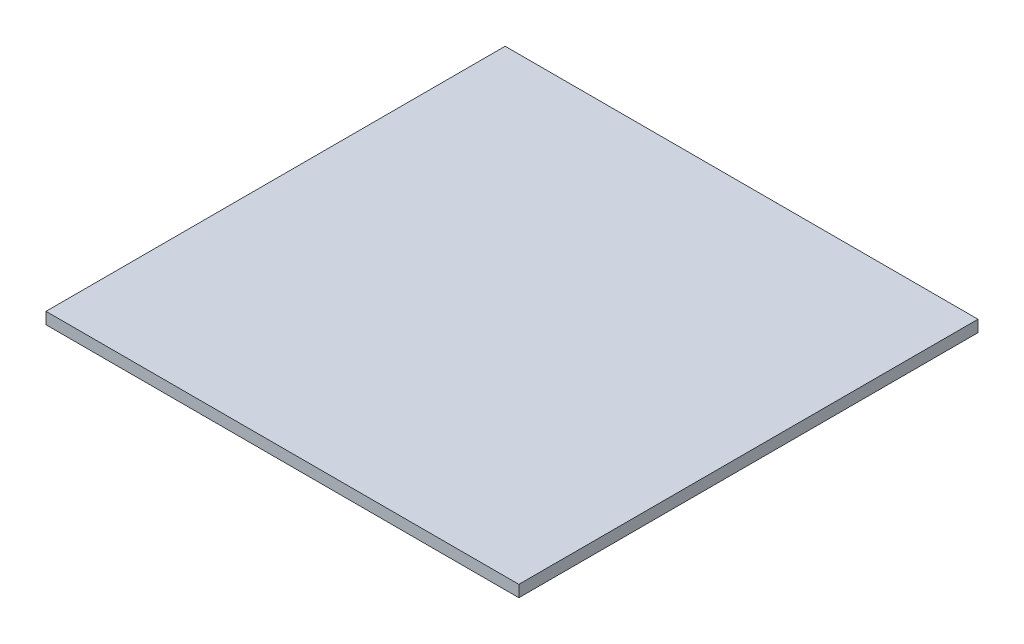
ISO-10303-21;
HEADER;
FILE_DESCRIPTION(('STEP AP214'),'2;1');
FILE_NAME('part.step','',(''),(''),'','','');
FILE_SCHEMA(('AUTOMOTIVE_DESIGN { 1 0 10303 214 1 1 1 1 }'));
ENDSEC;
DATA;
#1=APPLICATION_CONTEXT('core data for automotive mechanical design processes');
#2=APPLICATION_PROTOCOL_DEFINITION('international standard','automotive_design',2000,#1);
#3=PRODUCT_CONTEXT('',#1,'mechanical');
#4=PRODUCT('Part','Part','',(#3));
#5=PRODUCT_RELATED_PRODUCT_CATEGORY('part','',(#4));
#6=PRODUCT_DEFINITION_FORMATION('','',#4);
#7=PRODUCT_DEFINITION_CONTEXT('part definition',#1,'design');
#8=PRODUCT_DEFINITION('design','',#6,#7);
#9=PRODUCT_DEFINITION_SHAPE('','',#8);
#10=(LENGTH_UNIT() NAMED_UNIT(*) SI_UNIT(.MILLI.,.METRE.));
#11=(NAMED_UNIT(*) PLANE_ANGLE_UNIT() SI_UNIT($,.RADIAN.));
#12=(NAMED_UNIT(*) SI_UNIT($,.STERADIAN.) SOLID_ANGLE_UNIT());
#13=UNCERTAINTY_MEASURE_WITH_UNIT(LENGTH_MEASURE(1.E-05),#10,'distance_accuracy_value','');
#14=(GEOMETRIC_REPRESENTATION_CONTEXT(3) GLOBAL_UNCERTAINTY_ASSIGNED_CONTEXT((#13)) GLOBAL_UNIT_ASSIGNED_CONTEXT((#10,
#11,#12)) REPRESENTATION_CONTEXT('',''));
#15=CARTESIAN_POINT('',(0.,0.,0.));
#16=DIRECTION('',(0.,0.,1.));
#17=DIRECTION('',(1.,0.,0.));
#18=AXIS2_PLACEMENT_3D('',#15,#16,#17);
#19=CARTESIAN_POINT('',(0.,1.7,0.));
#20=DIRECTION('',(1.,0.,0.));
#21=DIRECTION('',(0.,0.,-1.));
#22=AXIS2_PLACEMENT_3D('',#19,#20,#21);
#23=PLANE('',#22);
#24=DIRECTION('',(0.,0.,1.));
#25=VECTOR('',#24,1.);
#26=CARTESIAN_POINT('',(0.,0.,0.));
#27=LINE('',#26,#25);
#28=CARTESIAN_POINT('',(0.,0.,-67.));
#29=VERTEX_POINT('',#28);
#30=CARTESIAN_POINT('',(0.,0.,0.));
#31=VERTEX_POINT('',#30);
#32=EDGE_CURVE('E95',#29,#31,#27,.T.);
#33=ORIENTED_EDGE('',*,*,#32,.T.);
#34=DIRECTION('',(0.,-1.,0.));
#35=VECTOR('',#34,1.);
#36=CARTESIAN_POINT('',(0.,1.7,0.));
#37=LINE('',#36,#35);
#38=CARTESIAN_POINT('',(0.,1.7,0.));
#39=VERTEX_POINT('',#38);
#40=EDGE_CURVE('E11',#39,#31,#37,.T.);
#41=ORIENTED_EDGE('',*,*,#40,.F.);
#42=DIRECTION('',(0.,0.,1.));
#43=VECTOR('',#42,1.);
#44=CARTESIAN_POINT('',(0.,1.7,0.));
#45=LINE('',#44,#43);
#46=CARTESIAN_POINT('',(0.,1.7,-67.));
#47=VERTEX_POINT('',#46);
#48=EDGE_CURVE('E83',#47,#39,#45,.T.);
#49=ORIENTED_EDGE('',*,*,#48,.F.);
#50=DIRECTION('',(0.,-1.,0.));
#51=VECTOR('',#50,1.);
#52=CARTESIAN_POINT('',(0.,1.7,-67.));
#53=LINE('',#52,#51);
#54=EDGE_CURVE('E91',#47,#29,#53,.T.);
#55=ORIENTED_EDGE('',*,*,#54,.T.);
#56=EDGE_LOOP('',(#33,#41,#49,#55));
#57=FACE_BOUND('',#56,.T.);
#58=ADVANCED_FACE('F32',(#57),#23,.F.);
#59=CARTESIAN_POINT('',(0.,1.7,0.));
#60=DIRECTION('',(0.,0.,-1.));
#61=DIRECTION('',(-1.,0.,0.));
#62=AXIS2_PLACEMENT_3D('',#59,#60,#61);
#63=PLANE('',#62);
#64=DIRECTION('',(1.,0.,0.));
#65=VECTOR('',#64,1.);
#66=CARTESIAN_POINT('',(0.,0.,0.));
#67=LINE('',#66,#65);
#68=CARTESIAN_POINT('',(69.,0.,0.));
#69=VERTEX_POINT('',#68);
#70=EDGE_CURVE('E87',#31,#69,#67,.T.);
#71=ORIENTED_EDGE('',*,*,#70,.T.);
#72=DIRECTION('',(0.,-1.,0.));
#73=VECTOR('',#72,1.);
#74=CARTESIAN_POINT('',(69.,1.7,0.));
#75=LINE('',#74,#73);
#76=CARTESIAN_POINT('',(69.,1.7,0.));
#77=VERTEX_POINT('',#76);
#78=EDGE_CURVE('E40',#77,#69,#75,.T.);
#79=ORIENTED_EDGE('',*,*,#78,.F.);
#80=DIRECTION('',(1.,0.,0.));
#81=VECTOR('',#80,1.);
#82=CARTESIAN_POINT('',(0.,1.7,0.));
#83=LINE('',#82,#81);
#84=EDGE_CURVE('E78',#39,#77,#83,.T.);
#85=ORIENTED_EDGE('',*,*,#84,.F.);
#86=ORIENTED_EDGE('',*,*,#40,.T.);
#87=EDGE_LOOP('',(#71,#79,#85,#86));
#88=FACE_BOUND('',#87,.T.);
#89=ADVANCED_FACE('F86',(#88),#63,.F.);
#90=CARTESIAN_POINT('',(69.,1.7,0.));
#91=DIRECTION('',(-1.,0.,0.));
#92=DIRECTION('',(0.,0.,1.));
#93=AXIS2_PLACEMENT_3D('',#90,#91,#92);
#94=PLANE('',#93);
#95=DIRECTION('',(0.,0.,-1.));
#96=VECTOR('',#95,1.);
#97=CARTESIAN_POINT('',(69.,0.,0.));
#98=LINE('',#97,#96);
#99=CARTESIAN_POINT('',(69.,0.,-67.));
#100=VERTEX_POINT('',#99);
#101=EDGE_CURVE('E65',#69,#100,#98,.T.);
#102=ORIENTED_EDGE('',*,*,#101,.T.);
#103=DIRECTION('',(0.,-1.,0.));
#104=VECTOR('',#103,1.);
#105=CARTESIAN_POINT('',(69.,1.7,-67.));
#106=LINE('',#105,#104);
#107=CARTESIAN_POINT('',(69.,1.7,-67.));
#108=VERTEX_POINT('',#107);
#109=EDGE_CURVE('E88',#108,#100,#106,.T.);
#110=ORIENTED_EDGE('',*,*,#109,.F.);
#111=DIRECTION('',(0.,0.,-1.));
#112=VECTOR('',#111,1.);
#113=CARTESIAN_POINT('',(69.,1.7,0.));
#114=LINE('',#113,#112);
#115=EDGE_CURVE('E81',#77,#108,#114,.T.);
#116=ORIENTED_EDGE('',*,*,#115,.F.);
#117=ORIENTED_EDGE('',*,*,#78,.T.);
#118=EDGE_LOOP('',(#102,#110,#116,#117));
#119=FACE_BOUND('',#118,.T.);
#120=ADVANCED_FACE('F89',(#119),#94,.F.);
#121=CARTESIAN_POINT('',(0.,1.7,-67.));
#122=DIRECTION('',(0.,0.,1.));
#123=DIRECTION('',(1.,0.,0.));
#124=AXIS2_PLACEMENT_3D('',#121,#122,#123);
#125=PLANE('',#124);
#126=DIRECTION('',(-1.,0.,0.));
#127=VECTOR('',#126,1.);
#128=CARTESIAN_POINT('',(0.,0.,-67.));
#129=LINE('',#128,#127);
#130=EDGE_CURVE('E71',#100,#29,#129,.T.);
#131=ORIENTED_EDGE('',*,*,#130,.T.);
#132=ORIENTED_EDGE('',*,*,#54,.F.);
#133=DIRECTION('',(-1.,0.,0.));
#134=VECTOR('',#133,1.);
#135=CARTESIAN_POINT('',(0.,1.7,-67.));
#136=LINE('',#135,#134);
#137=EDGE_CURVE('E48',#108,#47,#136,.T.);
#138=ORIENTED_EDGE('',*,*,#137,.F.);
#139=ORIENTED_EDGE('',*,*,#109,.T.);
#140=EDGE_LOOP('',(#131,#132,#138,#139));
#141=FACE_BOUND('',#140,.T.);
#142=ADVANCED_FACE('F102',(#141),#125,.F.);
#143=CARTESIAN_POINT('',(0.,1.7,0.));
#144=DIRECTION('',(0.,-1.,0.));
#145=DIRECTION('',(0.,0.,-1.));
#146=AXIS2_PLACEMENT_3D('',#143,#144,#145);
#147=PLANE('',#146);
#148=ORIENTED_EDGE('',*,*,#48,.T.);
#149=ORIENTED_EDGE('',*,*,#84,.T.);
#150=ORIENTED_EDGE('',*,*,#115,.T.);
#151=ORIENTED_EDGE('',*,*,#137,.T.);
#152=EDGE_LOOP('',(#148,#149,#150,#151));
#153=FACE_BOUND('',#152,.T.);
#154=ADVANCED_FACE('F79',(#153),#147,.F.);
#155=CARTESIAN_POINT('',(0.,0.,0.));
#156=DIRECTION('',(0.,-1.,0.));
#157=DIRECTION('',(0.,0.,-1.));
#158=AXIS2_PLACEMENT_3D('',#155,#156,#157);
#159=PLANE('',#158);
#160=ORIENTED_EDGE('',*,*,#32,.F.);
#161=ORIENTED_EDGE('',*,*,#130,.F.);
#162=ORIENTED_EDGE('',*,*,#101,.F.);
#163=ORIENTED_EDGE('',*,*,#70,.F.);
#164=EDGE_LOOP('',(#160,#161,#162,#163));
#165=FACE_BOUND('',#164,.T.);
#166=ADVANCED_FACE('F105',(#165),#159,.T.);
#167=CLOSED_SHELL('',(#58,#89,#120,#142,#154,#166));
#168=MANIFOLD_SOLID_BREP('B2',#167);
#169=ADVANCED_BREP_SHAPE_REPRESENTATION('',(#18,#168),#14);
#170=SHAPE_DEFINITION_REPRESENTATION(#9,#169);
ENDSEC;
END-ISO-10303-21;
